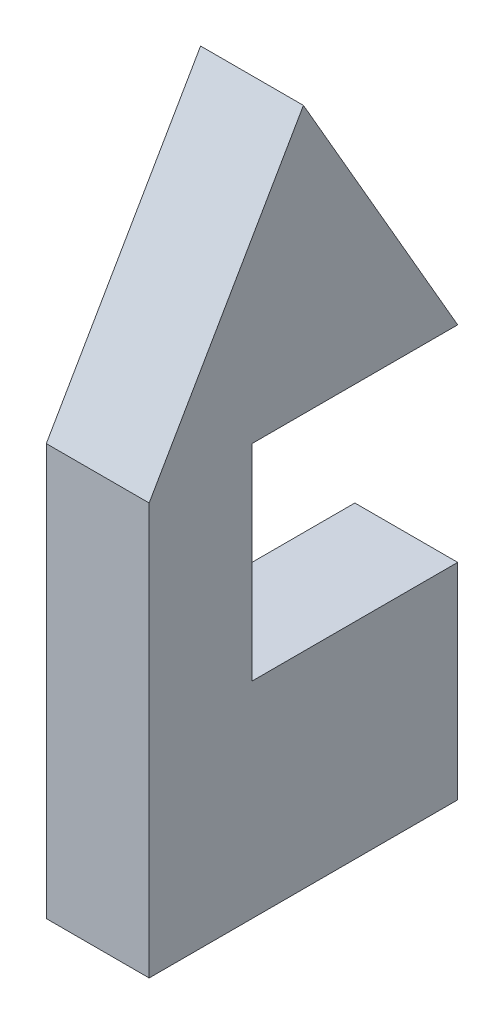
ISO-10303-21;
HEADER;
FILE_DESCRIPTION(('STEP AP214'),'2;1');
FILE_NAME('part.step','',(''),(''),'','','');
FILE_SCHEMA(('AUTOMOTIVE_DESIGN { 1 0 10303 214 1 1 1 1 }'));
ENDSEC;
DATA;
#1=APPLICATION_CONTEXT('core data for automotive mechanical design processes');
#2=APPLICATION_PROTOCOL_DEFINITION('international standard','automotive_design',2000,#1);
#3=PRODUCT_CONTEXT('',#1,'mechanical');
#4=PRODUCT('Part','Part','',(#3));
#5=PRODUCT_RELATED_PRODUCT_CATEGORY('part','',(#4));
#6=PRODUCT_DEFINITION_FORMATION('','',#4);
#7=PRODUCT_DEFINITION_CONTEXT('part definition',#1,'design');
#8=PRODUCT_DEFINITION('design','',#6,#7);
#9=PRODUCT_DEFINITION_SHAPE('','',#8);
#10=(LENGTH_UNIT() NAMED_UNIT(*) SI_UNIT(.MILLI.,.METRE.));
#11=(NAMED_UNIT(*) PLANE_ANGLE_UNIT() SI_UNIT($,.RADIAN.));
#12=(NAMED_UNIT(*) SI_UNIT($,.STERADIAN.) SOLID_ANGLE_UNIT());
#13=UNCERTAINTY_MEASURE_WITH_UNIT(LENGTH_MEASURE(1.E-05),#10,'distance_accuracy_value','');
#14=(GEOMETRIC_REPRESENTATION_CONTEXT(3) GLOBAL_UNCERTAINTY_ASSIGNED_CONTEXT((#13)) GLOBAL_UNIT_ASSIGNED_CONTEXT((#10,
#11,#12)) REPRESENTATION_CONTEXT('',''));
#15=CARTESIAN_POINT('',(0.,0.,0.));
#16=DIRECTION('',(0.,0.,1.));
#17=DIRECTION('',(1.,0.,0.));
#18=AXIS2_PLACEMENT_3D('',#15,#16,#17);
#19=CARTESIAN_POINT('',(1.,1.27237868212125,0.604410535080297));
#20=DIRECTION('',(0.,0.,1.));
#21=DIRECTION('',(0.,-1.,0.));
#22=AXIS2_PLACEMENT_3D('',#19,#20,#21);
#23=PLANE('',#22);
#24=DIRECTION('',(0.,1.,0.));
#25=VECTOR('',#24,1.);
#26=CARTESIAN_POINT('',(0.,1.27237868212125,0.604410535080297));
#27=LINE('',#26,#25);
#28=CARTESIAN_POINT('',(0.,-0.727621317878748,0.604410535080296));
#29=VERTEX_POINT('',#28);
#30=CARTESIAN_POINT('',(0.,1.27237868212125,0.604410535080297));
#31=VERTEX_POINT('',#30);
#32=EDGE_CURVE('E133',#29,#31,#27,.T.);
#33=ORIENTED_EDGE('',*,*,#32,.T.);
#34=DIRECTION('',(-1.,0.,0.));
#35=VECTOR('',#34,1.);
#36=CARTESIAN_POINT('',(1.,1.27237868212125,0.604410535080297));
#37=LINE('',#36,#35);
#38=CARTESIAN_POINT('',(1.,1.27237868212125,0.604410535080297));
#39=VERTEX_POINT('',#38);
#40=EDGE_CURVE('E11',#39,#31,#37,.T.);
#41=ORIENTED_EDGE('',*,*,#40,.F.);
#42=DIRECTION('',(0.,1.,0.));
#43=VECTOR('',#42,1.);
#44=CARTESIAN_POINT('',(1.,1.27237868212125,0.604410535080297));
#45=LINE('',#44,#43);
#46=CARTESIAN_POINT('',(1.,-0.727621317878748,0.604410535080296));
#47=VERTEX_POINT('',#46);
#48=EDGE_CURVE('E147',#47,#39,#45,.T.);
#49=ORIENTED_EDGE('',*,*,#48,.F.);
#50=DIRECTION('',(-1.,0.,0.));
#51=VECTOR('',#50,1.);
#52=CARTESIAN_POINT('',(1.,-0.727621317878748,0.604410535080296));
#53=LINE('',#52,#51);
#54=EDGE_CURVE('E129',#47,#29,#53,.T.);
#55=ORIENTED_EDGE('',*,*,#54,.T.);
#56=EDGE_LOOP('',(#33,#41,#49,#55));
#57=FACE_BOUND('',#56,.T.);
#58=ADVANCED_FACE('F37',(#57),#23,.F.);
#59=CARTESIAN_POINT('',(1.,1.27237868212125,2.6044105350803));
#60=DIRECTION('',(0.,-1.,0.));
#61=DIRECTION('',(0.,0.,-1.));
#62=AXIS2_PLACEMENT_3D('',#59,#60,#61);
#63=PLANE('',#62);
#64=DIRECTION('',(0.,0.,1.));
#65=VECTOR('',#64,1.);
#66=CARTESIAN_POINT('',(0.,1.27237868212125,2.6044105350803));
#67=LINE('',#66,#65);
#68=CARTESIAN_POINT('',(0.,1.27237868212125,2.6044105350803));
#69=VERTEX_POINT('',#68);
#70=EDGE_CURVE('E136',#31,#69,#67,.T.);
#71=ORIENTED_EDGE('',*,*,#70,.T.);
#72=DIRECTION('',(-1.,0.,0.));
#73=VECTOR('',#72,1.);
#74=CARTESIAN_POINT('',(1.,1.27237868212125,2.6044105350803));
#75=LINE('',#74,#73);
#76=CARTESIAN_POINT('',(1.,1.27237868212125,2.6044105350803));
#77=VERTEX_POINT('',#76);
#78=EDGE_CURVE('E45',#77,#69,#75,.T.);
#79=ORIENTED_EDGE('',*,*,#78,.F.);
#80=DIRECTION('',(0.,0.,1.));
#81=VECTOR('',#80,1.);
#82=CARTESIAN_POINT('',(1.,1.27237868212125,2.6044105350803));
#83=LINE('',#82,#81);
#84=EDGE_CURVE('E95',#39,#77,#83,.T.);
#85=ORIENTED_EDGE('',*,*,#84,.F.);
#86=ORIENTED_EDGE('',*,*,#40,.T.);
#87=EDGE_LOOP('',(#71,#79,#85,#86));
#88=FACE_BOUND('',#87,.T.);
#89=ADVANCED_FACE('F182',(#88),#63,.F.);
#90=CARTESIAN_POINT('',(1.,3.27237868212125,2.6044105350803));
#91=DIRECTION('',(0.,0.,1.));
#92=DIRECTION('',(0.,-1.,0.));
#93=AXIS2_PLACEMENT_3D('',#90,#91,#92);
#94=PLANE('',#93);
#95=DIRECTION('',(0.,1.,0.));
#96=VECTOR('',#95,1.);
#97=CARTESIAN_POINT('',(0.,3.27237868212125,2.6044105350803));
#98=LINE('',#97,#96);
#99=CARTESIAN_POINT('',(0.,3.27237868212125,2.6044105350803));
#100=VERTEX_POINT('',#99);
#101=EDGE_CURVE('E138',#69,#100,#98,.T.);
#102=ORIENTED_EDGE('',*,*,#101,.T.);
#103=DIRECTION('',(-1.,0.,0.));
#104=VECTOR('',#103,1.);
#105=CARTESIAN_POINT('',(1.,3.27237868212125,2.6044105350803));
#106=LINE('',#105,#104);
#107=CARTESIAN_POINT('',(1.,3.27237868212125,2.6044105350803));
#108=VERTEX_POINT('',#107);
#109=EDGE_CURVE('E154',#108,#100,#106,.T.);
#110=ORIENTED_EDGE('',*,*,#109,.F.);
#111=DIRECTION('',(0.,1.,0.));
#112=VECTOR('',#111,1.);
#113=CARTESIAN_POINT('',(1.,3.27237868212125,2.6044105350803));
#114=LINE('',#113,#112);
#115=EDGE_CURVE('E162',#77,#108,#114,.T.);
#116=ORIENTED_EDGE('',*,*,#115,.F.);
#117=ORIENTED_EDGE('',*,*,#78,.T.);
#118=EDGE_LOOP('',(#102,#110,#116,#117));
#119=FACE_BOUND('',#118,.T.);
#120=ADVANCED_FACE('F160',(#119),#94,.F.);
#121=CARTESIAN_POINT('',(1.,3.27237868212125,2.6044105350803));
#122=DIRECTION('',(0.,1.,0.));
#123=DIRECTION('',(0.,0.,1.));
#124=AXIS2_PLACEMENT_3D('',#121,#122,#123);
#125=PLANE('',#124);
#126=DIRECTION('',(0.,0.,-1.));
#127=VECTOR('',#126,1.);
#128=CARTESIAN_POINT('',(0.,3.27237868212125,2.6044105350803));
#129=LINE('',#128,#127);
#130=CARTESIAN_POINT('',(0.,3.27237868212125,0.604410535080297));
#131=VERTEX_POINT('',#130);
#132=EDGE_CURVE('E140',#100,#131,#129,.T.);
#133=ORIENTED_EDGE('',*,*,#132,.T.);
#134=DIRECTION('',(-1.,0.,0.));
#135=VECTOR('',#134,1.);
#136=CARTESIAN_POINT('',(1.,3.27237868212125,0.604410535080297));
#137=LINE('',#136,#135);
#138=CARTESIAN_POINT('',(1.,3.27237868212125,0.604410535080297));
#139=VERTEX_POINT('',#138);
#140=EDGE_CURVE('E151',#139,#131,#137,.T.);
#141=ORIENTED_EDGE('',*,*,#140,.F.);
#142=DIRECTION('',(0.,0.,-1.));
#143=VECTOR('',#142,1.);
#144=CARTESIAN_POINT('',(1.,3.27237868212125,2.6044105350803));
#145=LINE('',#144,#143);
#146=EDGE_CURVE('E174',#108,#139,#145,.T.);
#147=ORIENTED_EDGE('',*,*,#146,.F.);
#148=ORIENTED_EDGE('',*,*,#109,.T.);
#149=EDGE_LOOP('',(#133,#141,#147,#148));
#150=FACE_BOUND('',#149,.T.);
#151=ADVANCED_FACE('F170',(#150),#125,.F.);
#152=CARTESIAN_POINT('',(1.,3.27237868212125,0.604410535080297));
#153=DIRECTION('',(0.,-0.5,0.866025403784439));
#154=DIRECTION('',(0.,-0.866025403784439,-0.5));
#155=AXIS2_PLACEMENT_3D('',#152,#153,#154);
#156=PLANE('',#155);
#157=DIRECTION('',(0.,0.866025403784438,0.5));
#158=VECTOR('',#157,1.);
#159=CARTESIAN_POINT('',(0.,3.27237868212125,0.604410535080297));
#160=LINE('',#159,#158);
#161=CARTESIAN_POINT('',(0.,5.87045489347457,2.1044105350803));
#162=VERTEX_POINT('',#161);
#163=EDGE_CURVE('E142',#131,#162,#160,.T.);
#164=ORIENTED_EDGE('',*,*,#163,.T.);
#165=DIRECTION('',(-1.,0.,0.));
#166=VECTOR('',#165,1.);
#167=CARTESIAN_POINT('',(1.,5.87045489347457,2.1044105350803));
#168=LINE('',#167,#166);
#169=CARTESIAN_POINT('',(1.,5.87045489347457,2.1044105350803));
#170=VERTEX_POINT('',#169);
#171=EDGE_CURVE('E124',#170,#162,#168,.T.);
#172=ORIENTED_EDGE('',*,*,#171,.F.);
#173=DIRECTION('',(0.,0.866025403784438,0.5));
#174=VECTOR('',#173,1.);
#175=CARTESIAN_POINT('',(1.,3.27237868212125,0.604410535080297));
#176=LINE('',#175,#174);
#177=EDGE_CURVE('E114',#139,#170,#176,.T.);
#178=ORIENTED_EDGE('',*,*,#177,.F.);
#179=ORIENTED_EDGE('',*,*,#140,.T.);
#180=EDGE_LOOP('',(#164,#172,#178,#179));
#181=FACE_BOUND('',#180,.T.);
#182=ADVANCED_FACE('F173',(#181),#156,.F.);
#183=CARTESIAN_POINT('',(1.,5.87045489347457,2.1044105350803));
#184=DIRECTION('',(0.,-0.5,-0.866025403784439));
#185=DIRECTION('',(0.,0.866025403784439,-0.5));
#186=AXIS2_PLACEMENT_3D('',#183,#184,#185);
#187=PLANE('',#186);
#188=DIRECTION('',(0.,-0.866025403784439,0.5));
#189=VECTOR('',#188,1.);
#190=CARTESIAN_POINT('',(0.,5.87045489347457,2.1044105350803));
#191=LINE('',#190,#189);
#192=CARTESIAN_POINT('',(0.,3.27237868212125,3.6044105350803));
#193=VERTEX_POINT('',#192);
#194=EDGE_CURVE('E123',#162,#193,#191,.T.);
#195=ORIENTED_EDGE('',*,*,#194,.T.);
#196=DIRECTION('',(-1.,0.,0.));
#197=VECTOR('',#196,1.);
#198=CARTESIAN_POINT('',(1.,3.27237868212125,3.6044105350803));
#199=LINE('',#198,#197);
#200=CARTESIAN_POINT('',(1.,3.27237868212125,3.6044105350803));
#201=VERTEX_POINT('',#200);
#202=EDGE_CURVE('E120',#201,#193,#199,.T.);
#203=ORIENTED_EDGE('',*,*,#202,.F.);
#204=DIRECTION('',(0.,-0.866025403784439,0.5));
#205=VECTOR('',#204,1.);
#206=CARTESIAN_POINT('',(1.,5.87045489347457,2.1044105350803));
#207=LINE('',#206,#205);
#208=EDGE_CURVE('E108',#170,#201,#207,.T.);
#209=ORIENTED_EDGE('',*,*,#208,.F.);
#210=ORIENTED_EDGE('',*,*,#171,.T.);
#211=EDGE_LOOP('',(#195,#203,#209,#210));
#212=FACE_BOUND('',#211,.T.);
#213=ADVANCED_FACE('F121',(#212),#187,.F.);
#214=CARTESIAN_POINT('',(1.,1.27237868212125,3.6044105350803));
#215=DIRECTION('',(0.,0.,-1.));
#216=DIRECTION('',(0.,1.,0.));
#217=AXIS2_PLACEMENT_3D('',#214,#215,#216);
#218=PLANE('',#217);
#219=DIRECTION('',(0.,-1.,0.));
#220=VECTOR('',#219,1.);
#221=CARTESIAN_POINT('',(0.,1.27237868212125,3.6044105350803));
#222=LINE('',#221,#220);
#223=CARTESIAN_POINT('',(0.,-0.727621317878748,3.6044105350803));
#224=VERTEX_POINT('',#223);
#225=EDGE_CURVE('E81',#193,#224,#222,.T.);
#226=ORIENTED_EDGE('',*,*,#225,.T.);
#227=DIRECTION('',(-1.,0.,0.));
#228=VECTOR('',#227,1.);
#229=CARTESIAN_POINT('',(1.,-0.727621317878748,3.6044105350803));
#230=LINE('',#229,#228);
#231=CARTESIAN_POINT('',(1.,-0.727621317878748,3.6044105350803));
#232=VERTEX_POINT('',#231);
#233=EDGE_CURVE('E125',#232,#224,#230,.T.);
#234=ORIENTED_EDGE('',*,*,#233,.F.);
#235=DIRECTION('',(0.,-1.,0.));
#236=VECTOR('',#235,1.);
#237=CARTESIAN_POINT('',(1.,3.27237868212125,3.6044105350803));
#238=LINE('',#237,#236);
#239=EDGE_CURVE('E112',#201,#232,#238,.T.);
#240=ORIENTED_EDGE('',*,*,#239,.F.);
#241=ORIENTED_EDGE('',*,*,#202,.T.);
#242=EDGE_LOOP('',(#226,#234,#240,#241));
#243=FACE_BOUND('',#242,.T.);
#244=ADVANCED_FACE('F127',(#243),#218,.F.);
#245=CARTESIAN_POINT('',(1.,-0.727621317878748,3.6044105350803));
#246=DIRECTION('',(0.,1.,0.));
#247=DIRECTION('',(0.,0.,1.));
#248=AXIS2_PLACEMENT_3D('',#245,#246,#247);
#249=PLANE('',#248);
#250=DIRECTION('',(0.,0.,-1.));
#251=VECTOR('',#250,1.);
#252=CARTESIAN_POINT('',(0.,-0.727621317878748,3.6044105350803));
#253=LINE('',#252,#251);
#254=EDGE_CURVE('E87',#224,#29,#253,.T.);
#255=ORIENTED_EDGE('',*,*,#254,.T.);
#256=ORIENTED_EDGE('',*,*,#54,.F.);
#257=DIRECTION('',(0.,0.,-1.));
#258=VECTOR('',#257,1.);
#259=CARTESIAN_POINT('',(1.,-0.727621317878748,3.6044105350803));
#260=LINE('',#259,#258);
#261=EDGE_CURVE('E53',#232,#47,#260,.T.);
#262=ORIENTED_EDGE('',*,*,#261,.F.);
#263=ORIENTED_EDGE('',*,*,#233,.T.);
#264=EDGE_LOOP('',(#255,#256,#262,#263));
#265=FACE_BOUND('',#264,.T.);
#266=ADVANCED_FACE('F198',(#265),#249,.F.);
#267=CARTESIAN_POINT('',(1.,0.,0.));
#268=DIRECTION('',(1.,0.,0.));
#269=DIRECTION('',(0.,0.,-1.));
#270=AXIS2_PLACEMENT_3D('',#267,#268,#269);
#271=PLANE('',#270);
#272=ORIENTED_EDGE('',*,*,#48,.T.);
#273=ORIENTED_EDGE('',*,*,#84,.T.);
#274=ORIENTED_EDGE('',*,*,#115,.T.);
#275=ORIENTED_EDGE('',*,*,#146,.T.);
#276=ORIENTED_EDGE('',*,*,#177,.T.);
#277=ORIENTED_EDGE('',*,*,#208,.T.);
#278=ORIENTED_EDGE('',*,*,#239,.T.);
#279=ORIENTED_EDGE('',*,*,#261,.T.);
#280=EDGE_LOOP('',(#272,#273,#274,#275,#276,#277,#278,#279));
#281=FACE_BOUND('',#280,.T.);
#282=ADVANCED_FACE('F110',(#281),#271,.T.);
#283=CARTESIAN_POINT('',(0.,0.,0.));
#284=DIRECTION('',(1.,0.,0.));
#285=DIRECTION('',(0.,0.,-1.));
#286=AXIS2_PLACEMENT_3D('',#283,#284,#285);
#287=PLANE('',#286);
#288=ORIENTED_EDGE('',*,*,#32,.F.);
#289=ORIENTED_EDGE('',*,*,#254,.F.);
#290=ORIENTED_EDGE('',*,*,#225,.F.);
#291=ORIENTED_EDGE('',*,*,#194,.F.);
#292=ORIENTED_EDGE('',*,*,#163,.F.);
#293=ORIENTED_EDGE('',*,*,#132,.F.);
#294=ORIENTED_EDGE('',*,*,#101,.F.);
#295=ORIENTED_EDGE('',*,*,#70,.F.);
#296=EDGE_LOOP('',(#288,#289,#290,#291,#292,#293,#294,#295));
#297=FACE_BOUND('',#296,.T.);
#298=ADVANCED_FACE('F166',(#297),#287,.F.);
#299=CLOSED_SHELL('',(#58,#89,#120,#151,#182,#213,#244,#266,#282,#298));
#300=MANIFOLD_SOLID_BREP('B2',#299);
#301=ADVANCED_BREP_SHAPE_REPRESENTATION('',(#18,#300),#14);
#302=SHAPE_DEFINITION_REPRESENTATION(#9,#301);
ENDSEC;
END-ISO-10303-21;
